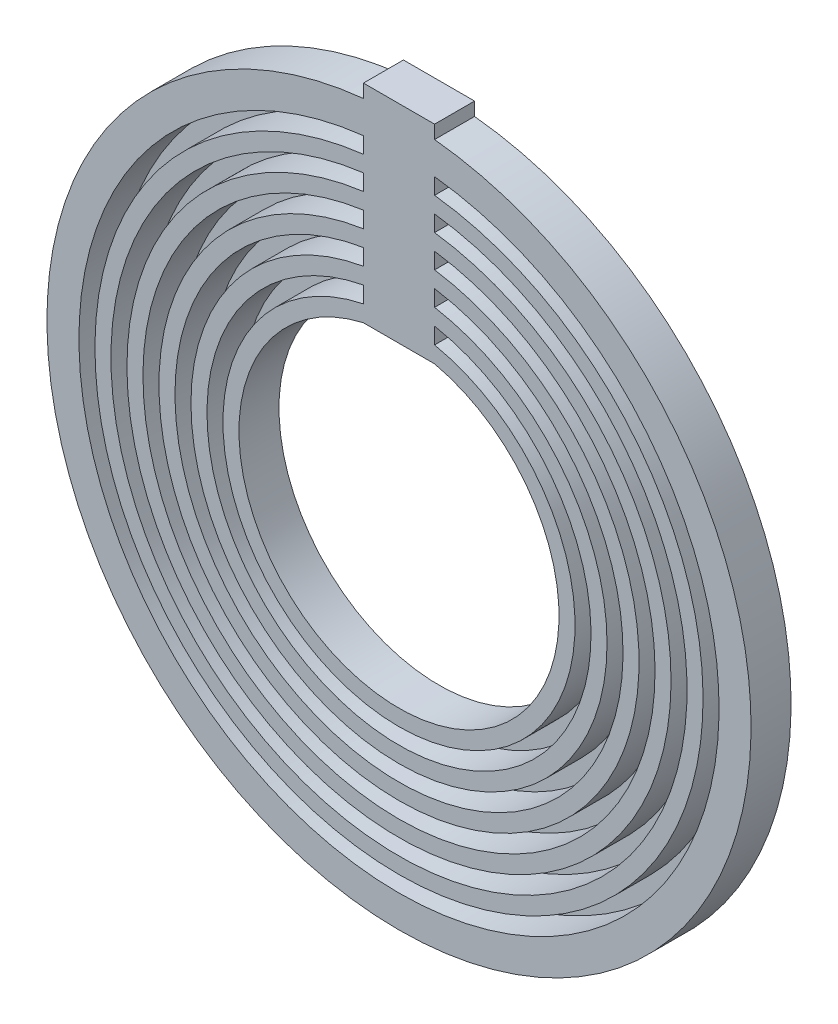
ISO-10303-21;
HEADER;
FILE_DESCRIPTION(('STEP AP214'),'2;1');
FILE_NAME('part.step','',(''),(''),'','','');
FILE_SCHEMA(('AUTOMOTIVE_DESIGN { 1 0 10303 214 1 1 1 1 }'));
ENDSEC;
DATA;
#1=APPLICATION_CONTEXT('core data for automotive mechanical design processes');
#2=APPLICATION_PROTOCOL_DEFINITION('international standard','automotive_design',2000,#1);
#3=PRODUCT_CONTEXT('',#1,'mechanical');
#4=PRODUCT('Part','Part','',(#3));
#5=PRODUCT_RELATED_PRODUCT_CATEGORY('part','',(#4));
#6=PRODUCT_DEFINITION_FORMATION('','',#4);
#7=PRODUCT_DEFINITION_CONTEXT('part definition',#1,'design');
#8=PRODUCT_DEFINITION('design','',#6,#7);
#9=PRODUCT_DEFINITION_SHAPE('','',#8);
#10=(LENGTH_UNIT() NAMED_UNIT(*) SI_UNIT(.MILLI.,.METRE.));
#11=(NAMED_UNIT(*) PLANE_ANGLE_UNIT() SI_UNIT($,.RADIAN.));
#12=(NAMED_UNIT(*) SI_UNIT($,.STERADIAN.) SOLID_ANGLE_UNIT());
#13=UNCERTAINTY_MEASURE_WITH_UNIT(LENGTH_MEASURE(1.E-05),#10,'distance_accuracy_value','');
#14=(GEOMETRIC_REPRESENTATION_CONTEXT(3) GLOBAL_UNCERTAINTY_ASSIGNED_CONTEXT((#13)) GLOBAL_UNIT_ASSIGNED_CONTEXT((#10,
#11,#12)) REPRESENTATION_CONTEXT('',''));
#15=CARTESIAN_POINT('',(0.,0.,0.));
#16=DIRECTION('',(0.,0.,1.));
#17=DIRECTION('',(1.,0.,0.));
#18=AXIS2_PLACEMENT_3D('',#15,#16,#17);
#19=CARTESIAN_POINT('',(0.,0.,2.5));
#20=DIRECTION('',(0.,0.,-1.));
#21=DIRECTION('',(-1.,0.,0.));
#22=AXIS2_PLACEMENT_3D('',#19,#20,#21);
#23=CYLINDRICAL_SURFACE('',#22,10.);
#24=CARTESIAN_POINT('',(0.,0.,2.5));
#25=DIRECTION('',(0.,0.,1.));
#26=DIRECTION('',(1.,0.,0.));
#27=AXIS2_PLACEMENT_3D('',#24,#25,#26);
#28=CIRCLE('',#27,10.);
#29=CARTESIAN_POINT('',(-2.22204860432891,9.75,2.5));
#30=VERTEX_POINT('',#29);
#31=CARTESIAN_POINT('',(2.22204860432891,9.75,2.5));
#32=VERTEX_POINT('',#31);
#33=EDGE_CURVE('E452',#30,#32,#28,.T.);
#34=ORIENTED_EDGE('',*,*,#33,.T.);
#35=DIRECTION('',(0.,0.,1.));
#36=VECTOR('',#35,1.);
#37=CARTESIAN_POINT('',(2.22204860432891,9.75,0.));
#38=LINE('',#37,#36);
#39=CARTESIAN_POINT('',(2.22204860432889,9.75,0.));
#40=VERTEX_POINT('',#39);
#41=EDGE_CURVE('E315',#40,#32,#38,.T.);
#42=ORIENTED_EDGE('',*,*,#41,.F.);
#43=CARTESIAN_POINT('',(0.,0.,0.));
#44=DIRECTION('',(0.,0.,1.));
#45=DIRECTION('',(1.,0.,0.));
#46=AXIS2_PLACEMENT_3D('',#43,#44,#45);
#47=CIRCLE('',#46,10.);
#48=CARTESIAN_POINT('',(-2.22204860432891,9.75,0.));
#49=VERTEX_POINT('',#48);
#50=EDGE_CURVE('E118',#49,#40,#47,.T.);
#51=ORIENTED_EDGE('',*,*,#50,.F.);
#52=DIRECTION('',(0.,0.,1.));
#53=VECTOR('',#52,1.);
#54=CARTESIAN_POINT('',(-2.22204860432891,9.75,0.));
#55=LINE('',#54,#53);
#56=EDGE_CURVE('E277',#49,#30,#55,.T.);
#57=ORIENTED_EDGE('',*,*,#56,.T.);
#58=EDGE_LOOP('',(#34,#42,#51,#57));
#59=FACE_BOUND('',#58,.T.);
#60=ADVANCED_FACE('F95',(#59),#23,.F.);
#61=CARTESIAN_POINT('',(0.,0.,2.5));
#62=DIRECTION('',(0.,0.,1.));
#63=DIRECTION('',(1.,0.,0.));
#64=AXIS2_PLACEMENT_3D('',#61,#62,#63);
#65=PLANE('',#64);
#66=CARTESIAN_POINT('',(0.,0.,2.5));
#67=DIRECTION('',(0.,0.,1.));
#68=DIRECTION('',(1.,0.,0.));
#69=AXIS2_PLACEMENT_3D('',#66,#67,#68);
#70=CIRCLE('',#69,19.);
#71=CARTESIAN_POINT('',(-2.22204860432891,18.8696184381137,2.5));
#72=VERTEX_POINT('',#71);
#73=CARTESIAN_POINT('',(2.22204860432891,18.8696184381137,2.5));
#74=VERTEX_POINT('',#73);
#75=EDGE_CURVE('E397',#72,#74,#70,.T.);
#76=ORIENTED_EDGE('',*,*,#75,.T.);
#77=DIRECTION('',(0.,1.,0.));
#78=VECTOR('',#77,1.);
#79=CARTESIAN_POINT('',(2.22204860432891,0.,2.5));
#80=LINE('',#79,#78);
#81=CARTESIAN_POINT('',(2.22204860432891,19.876179210301,2.5));
#82=VERTEX_POINT('',#81);
#83=EDGE_CURVE('E312',#74,#82,#80,.T.);
#84=ORIENTED_EDGE('',*,*,#83,.T.);
#85=CARTESIAN_POINT('',(0.,0.,2.5));
#86=DIRECTION('',(0.,0.,1.));
#87=DIRECTION('',(1.,0.,0.));
#88=AXIS2_PLACEMENT_3D('',#85,#86,#87);
#89=CIRCLE('',#88,20.);
#90=CARTESIAN_POINT('',(-2.22204860432891,19.876179210301,2.5));
#91=VERTEX_POINT('',#90);
#92=EDGE_CURVE('E402',#91,#82,#89,.T.);
#93=ORIENTED_EDGE('',*,*,#92,.F.);
#94=DIRECTION('',(0.,-1.,0.));
#95=VECTOR('',#94,1.);
#96=CARTESIAN_POINT('',(-2.22204860432891,0.,2.5));
#97=LINE('',#96,#95);
#98=EDGE_CURVE('E309',#91,#72,#97,.T.);
#99=ORIENTED_EDGE('',*,*,#98,.T.);
#100=EDGE_LOOP('',(#76,#84,#93,#99));
#101=FACE_BOUND('',#100,.T.);
#102=CARTESIAN_POINT('',(0.,0.,2.5));
#103=DIRECTION('',(0.,0.,1.));
#104=DIRECTION('',(1.,0.,0.));
#105=AXIS2_PLACEMENT_3D('',#102,#103,#104);
#106=CIRCLE('',#105,17.);
#107=CARTESIAN_POINT('',(-2.22204860432891,16.8541537906832,2.5));
#108=VERTEX_POINT('',#107);
#109=CARTESIAN_POINT('',(2.22204860432891,16.8541537906832,2.5));
#110=VERTEX_POINT('',#109);
#111=EDGE_CURVE('E405',#108,#110,#106,.T.);
#112=ORIENTED_EDGE('',*,*,#111,.T.);
#113=CARTESIAN_POINT('',(2.22204860432891,17.8623206778962,2.5));
#114=VERTEX_POINT('',#113);
#115=EDGE_CURVE('E478',#110,#114,#80,.T.);
#116=ORIENTED_EDGE('',*,*,#115,.T.);
#117=CARTESIAN_POINT('',(0.,0.,2.5));
#118=DIRECTION('',(0.,0.,1.));
#119=DIRECTION('',(1.,0.,0.));
#120=AXIS2_PLACEMENT_3D('',#117,#118,#119);
#121=CIRCLE('',#120,18.);
#122=CARTESIAN_POINT('',(-2.22204860432891,17.8623206778962,2.5));
#123=VERTEX_POINT('',#122);
#124=EDGE_CURVE('E413',#123,#114,#121,.T.);
#125=ORIENTED_EDGE('',*,*,#124,.F.);
#126=EDGE_CURVE('E509',#123,#108,#97,.T.);
#127=ORIENTED_EDGE('',*,*,#126,.T.);
#128=EDGE_LOOP('',(#112,#116,#125,#127));
#129=FACE_BOUND('',#128,.T.);
#130=CARTESIAN_POINT('',(0.,0.,2.5));
#131=DIRECTION('',(0.,0.,1.));
#132=DIRECTION('',(1.,0.,0.));
#133=AXIS2_PLACEMENT_3D('',#130,#131,#132);
#134=CIRCLE('',#133,15.);
#135=CARTESIAN_POINT('',(-2.22204860432891,14.8345036991468,2.5));
#136=VERTEX_POINT('',#135);
#137=CARTESIAN_POINT('',(2.22204860432891,14.8345036991468,2.5));
#138=VERTEX_POINT('',#137);
#139=EDGE_CURVE('E416',#136,#138,#134,.T.);
#140=ORIENTED_EDGE('',*,*,#139,.T.);
#141=CARTESIAN_POINT('',(2.22204860432891,15.8449518774908,2.5));
#142=VERTEX_POINT('',#141);
#143=EDGE_CURVE('E480',#138,#142,#80,.T.);
#144=ORIENTED_EDGE('',*,*,#143,.T.);
#145=CARTESIAN_POINT('',(0.,0.,2.5));
#146=DIRECTION('',(0.,0.,1.));
#147=DIRECTION('',(1.,0.,0.));
#148=AXIS2_PLACEMENT_3D('',#145,#146,#147);
#149=CIRCLE('',#148,16.);
#150=CARTESIAN_POINT('',(-2.22204860432891,15.8449518774908,2.5));
#151=VERTEX_POINT('',#150);
#152=EDGE_CURVE('E424',#151,#142,#149,.T.);
#153=ORIENTED_EDGE('',*,*,#152,.F.);
#154=EDGE_CURVE('E507',#151,#136,#97,.T.);
#155=ORIENTED_EDGE('',*,*,#154,.T.);
#156=EDGE_LOOP('',(#140,#144,#153,#155));
#157=FACE_BOUND('',#156,.T.);
#158=CARTESIAN_POINT('',(0.,0.,2.5));
#159=DIRECTION('',(0.,0.,1.));
#160=DIRECTION('',(1.,0.,0.));
#161=AXIS2_PLACEMENT_3D('',#158,#159,#160);
#162=CIRCLE('',#161,13.);
#163=CARTESIAN_POINT('',(-2.22204860432891,12.8086884574495,2.5));
#164=VERTEX_POINT('',#163);
#165=CARTESIAN_POINT('',(2.22204860432891,12.8086884574495,2.5));
#166=VERTEX_POINT('',#165);
#167=EDGE_CURVE('E427',#164,#166,#162,.T.);
#168=ORIENTED_EDGE('',*,*,#167,.T.);
#169=CARTESIAN_POINT('',(2.22204860432891,13.8225359467791,2.5));
#170=VERTEX_POINT('',#169);
#171=EDGE_CURVE('E298',#166,#170,#80,.T.);
#172=ORIENTED_EDGE('',*,*,#171,.T.);
#173=CARTESIAN_POINT('',(0.,0.,2.5));
#174=DIRECTION('',(0.,0.,1.));
#175=DIRECTION('',(1.,0.,0.));
#176=AXIS2_PLACEMENT_3D('',#173,#174,#175);
#177=CIRCLE('',#176,14.);
#178=CARTESIAN_POINT('',(-2.22204860432891,13.8225359467791,2.5));
#179=VERTEX_POINT('',#178);
#180=EDGE_CURVE('E435',#179,#170,#177,.T.);
#181=ORIENTED_EDGE('',*,*,#180,.F.);
#182=EDGE_CURVE('E506',#179,#164,#97,.T.);
#183=ORIENTED_EDGE('',*,*,#182,.T.);
#184=EDGE_LOOP('',(#168,#172,#181,#183));
#185=FACE_BOUND('',#184,.T.);
#186=CARTESIAN_POINT('',(0.,0.,2.5));
#187=DIRECTION('',(0.,0.,1.));
#188=DIRECTION('',(1.,0.,0.));
#189=AXIS2_PLACEMENT_3D('',#186,#187,#188);
#190=CIRCLE('',#189,11.);
#191=CARTESIAN_POINT('',(-2.22204860432891,10.7732307132076,2.5));
#192=VERTEX_POINT('',#191);
#193=CARTESIAN_POINT('',(2.22204860432891,10.7732307132076,2.5));
#194=VERTEX_POINT('',#193);
#195=EDGE_CURVE('E438',#192,#194,#190,.T.);
#196=ORIENTED_EDGE('',*,*,#195,.T.);
#197=CARTESIAN_POINT('',(2.22204860432891,11.7924764150708,2.5));
#198=VERTEX_POINT('',#197);
#199=EDGE_CURVE('E295',#194,#198,#80,.T.);
#200=ORIENTED_EDGE('',*,*,#199,.T.);
#201=CARTESIAN_POINT('',(0.,0.,2.5));
#202=DIRECTION('',(0.,0.,1.));
#203=DIRECTION('',(1.,0.,0.));
#204=AXIS2_PLACEMENT_3D('',#201,#202,#203);
#205=CIRCLE('',#204,12.);
#206=CARTESIAN_POINT('',(-2.22204860432891,11.7924764150708,2.5));
#207=VERTEX_POINT('',#206);
#208=EDGE_CURVE('E446',#207,#198,#205,.T.);
#209=ORIENTED_EDGE('',*,*,#208,.F.);
#210=EDGE_CURVE('E306',#207,#192,#97,.T.);
#211=ORIENTED_EDGE('',*,*,#210,.T.);
#212=EDGE_LOOP('',(#196,#200,#209,#211));
#213=FACE_BOUND('',#212,.T.);
#214=CARTESIAN_POINT('',(0.,0.,2.5));
#215=DIRECTION('',(0.,0.,1.));
#216=DIRECTION('',(1.,0.,0.));
#217=AXIS2_PLACEMENT_3D('',#214,#215,#216);
#218=CIRCLE('',#217,22.);
#219=CARTESIAN_POINT('',(-2.22204860432891,21.8874964306108,2.5));
#220=VERTEX_POINT('',#219);
#221=CARTESIAN_POINT('',(2.22204860432891,21.8874964306108,2.5));
#222=VERTEX_POINT('',#221);
#223=EDGE_CURVE('E455',#220,#222,#218,.T.);
#224=ORIENTED_EDGE('',*,*,#223,.T.);
#225=CARTESIAN_POINT('',(2.22204860432891,22.7219771811562,2.5));
#226=VERTEX_POINT('',#225);
#227=EDGE_CURVE('E300',#222,#226,#80,.T.);
#228=ORIENTED_EDGE('',*,*,#227,.T.);
#229=DIRECTION('',(-1.,0.,0.));
#230=VECTOR('',#229,1.);
#231=CARTESIAN_POINT('',(0.,22.7219771811562,2.5));
#232=LINE('',#231,#230);
#233=CARTESIAN_POINT('',(-2.22204860432891,22.7219771811562,2.5));
#234=VERTEX_POINT('',#233);
#235=EDGE_CURVE('E304',#226,#234,#232,.T.);
#236=ORIENTED_EDGE('',*,*,#235,.T.);
#237=EDGE_CURVE('E110',#234,#220,#97,.T.);
#238=ORIENTED_EDGE('',*,*,#237,.T.);
#239=EDGE_LOOP('',(#224,#228,#236,#238));
#240=FACE_BOUND('',#239,.T.);
#241=DIRECTION('',(-1.,0.,0.));
#242=VECTOR('',#241,1.);
#243=CARTESIAN_POINT('',(0.,9.75,2.5));
#244=LINE('',#243,#242);
#245=EDGE_CURVE('E308',#32,#30,#244,.T.);
#246=ORIENTED_EDGE('',*,*,#245,.F.);
#247=ORIENTED_EDGE('',*,*,#33,.F.);
#248=EDGE_LOOP('',(#246,#247));
#249=FACE_BOUND('',#248,.T.);
#250=ADVANCED_FACE('F476',(#101,#129,#157,#185,#213,#240,#249),#65,.T.);
#251=CARTESIAN_POINT('',(0.,0.,0.));
#252=DIRECTION('',(0.,0.,1.));
#253=DIRECTION('',(1.,0.,0.));
#254=AXIS2_PLACEMENT_3D('',#251,#252,#253);
#255=PLANE('',#254);
#256=DIRECTION('',(0.,1.,0.));
#257=VECTOR('',#256,1.);
#258=CARTESIAN_POINT('',(2.22204860432891,0.,0.));
#259=LINE('',#258,#257);
#260=CARTESIAN_POINT('',(2.22204860432891,21.8874964306108,0.));
#261=VERTEX_POINT('',#260);
#262=CARTESIAN_POINT('',(2.22204860432891,22.7219771811562,0.));
#263=VERTEX_POINT('',#262);
#264=EDGE_CURVE('E278',#261,#263,#259,.T.);
#265=ORIENTED_EDGE('',*,*,#264,.F.);
#266=CARTESIAN_POINT('',(0.,0.,0.));
#267=DIRECTION('',(0.,0.,1.));
#268=DIRECTION('',(1.,0.,0.));
#269=AXIS2_PLACEMENT_3D('',#266,#267,#268);
#270=CIRCLE('',#269,22.);
#271=CARTESIAN_POINT('',(-2.22204860432891,21.8874964306108,0.));
#272=VERTEX_POINT('',#271);
#273=EDGE_CURVE('E288',#272,#261,#270,.T.);
#274=ORIENTED_EDGE('',*,*,#273,.F.);
#275=DIRECTION('',(0.,-1.,0.));
#276=VECTOR('',#275,1.);
#277=CARTESIAN_POINT('',(-2.22204860432891,0.,0.));
#278=LINE('',#277,#276);
#279=CARTESIAN_POINT('',(-2.22204860432891,22.7219771811562,0.));
#280=VERTEX_POINT('',#279);
#281=EDGE_CURVE('E272',#280,#272,#278,.T.);
#282=ORIENTED_EDGE('',*,*,#281,.F.);
#283=DIRECTION('',(-1.,0.,0.));
#284=VECTOR('',#283,1.);
#285=CARTESIAN_POINT('',(0.,22.7219771811562,0.));
#286=LINE('',#285,#284);
#287=EDGE_CURVE('E286',#263,#280,#286,.T.);
#288=ORIENTED_EDGE('',*,*,#287,.F.);
#289=EDGE_LOOP('',(#265,#274,#282,#288));
#290=FACE_BOUND('',#289,.T.);
#291=ORIENTED_EDGE('',*,*,#50,.T.);
#292=DIRECTION('',(-1.,0.,0.));
#293=VECTOR('',#292,1.);
#294=CARTESIAN_POINT('',(0.,9.75,0.));
#295=LINE('',#294,#293);
#296=EDGE_CURVE('E289',#40,#49,#295,.T.);
#297=ORIENTED_EDGE('',*,*,#296,.T.);
#298=EDGE_LOOP('',(#291,#297));
#299=FACE_BOUND('',#298,.T.);
#300=ADVANCED_FACE('F284',(#290,#299),#255,.F.);
#301=CARTESIAN_POINT('',(0.,0.,2.5));
#302=DIRECTION('',(0.,0.,-1.));
#303=DIRECTION('',(-1.,0.,0.));
#304=AXIS2_PLACEMENT_3D('',#301,#302,#303);
#305=CYLINDRICAL_SURFACE('',#304,22.);
#306=ORIENTED_EDGE('',*,*,#273,.T.);
#307=DIRECTION('',(0.,0.,-1.));
#308=VECTOR('',#307,1.);
#309=CARTESIAN_POINT('',(2.22204860432891,21.8874964306108,2.5));
#310=LINE('',#309,#308);
#311=EDGE_CURVE('E394',#261,#222,#310,.F.);
#312=ORIENTED_EDGE('',*,*,#311,.T.);
#313=ORIENTED_EDGE('',*,*,#223,.F.);
#314=DIRECTION('',(0.,0.,-1.));
#315=VECTOR('',#314,1.);
#316=CARTESIAN_POINT('',(-2.22204860432891,21.8874964306108,2.5));
#317=LINE('',#316,#315);
#318=EDGE_CURVE('E355',#220,#272,#317,.T.);
#319=ORIENTED_EDGE('',*,*,#318,.T.);
#320=EDGE_LOOP('',(#306,#312,#313,#319));
#321=FACE_BOUND('',#320,.T.);
#322=ADVANCED_FACE('F97',(#321),#305,.T.);
#323=CARTESIAN_POINT('',(0.,0.,0.25));
#324=DIRECTION('',(0.,0.,1.));
#325=DIRECTION('',(1.,0.,0.));
#326=AXIS2_PLACEMENT_3D('',#323,#324,#325);
#327=CYLINDRICAL_SURFACE('',#326,11.);
#328=DIRECTION('',(0.,0.,1.));
#329=VECTOR('',#328,1.);
#330=CARTESIAN_POINT('',(2.22204860432891,10.7732307132076,0.25));
#331=LINE('',#330,#329);
#332=CARTESIAN_POINT('',(2.22204860432891,10.7732307132076,0.25));
#333=VERTEX_POINT('',#332);
#334=EDGE_CURVE('E391',#194,#333,#331,.F.);
#335=ORIENTED_EDGE('',*,*,#334,.F.);
#336=ORIENTED_EDGE('',*,*,#195,.F.);
#337=DIRECTION('',(0.,0.,1.));
#338=VECTOR('',#337,1.);
#339=CARTESIAN_POINT('',(-2.22204860432891,10.7732307132076,0.25));
#340=LINE('',#339,#338);
#341=CARTESIAN_POINT('',(-2.22204860432891,10.7732307132076,0.25));
#342=VERTEX_POINT('',#341);
#343=EDGE_CURVE('E352',#342,#192,#340,.T.);
#344=ORIENTED_EDGE('',*,*,#343,.F.);
#345=CARTESIAN_POINT('',(0.,0.,0.25));
#346=DIRECTION('',(0.,0.,1.));
#347=DIRECTION('',(1.,0.,0.));
#348=AXIS2_PLACEMENT_3D('',#345,#346,#347);
#349=CIRCLE('',#348,11.);
#350=EDGE_CURVE('E442',#342,#333,#349,.T.);
#351=ORIENTED_EDGE('',*,*,#350,.T.);
#352=EDGE_LOOP('',(#335,#336,#344,#351));
#353=FACE_BOUND('',#352,.T.);
#354=ADVANCED_FACE('F519',(#353),#327,.T.);
#355=CARTESIAN_POINT('',(0.,0.,0.25));
#356=DIRECTION('',(0.,0.,1.));
#357=DIRECTION('',(1.,0.,0.));
#358=AXIS2_PLACEMENT_3D('',#355,#356,#357);
#359=CYLINDRICAL_SURFACE('',#358,12.);
#360=ORIENTED_EDGE('',*,*,#208,.T.);
#361=DIRECTION('',(0.,0.,1.));
#362=VECTOR('',#361,1.);
#363=CARTESIAN_POINT('',(2.22204860432891,11.7924764150708,0.25));
#364=LINE('',#363,#362);
#365=CARTESIAN_POINT('',(2.22204860432891,11.7924764150708,0.25));
#366=VERTEX_POINT('',#365);
#367=EDGE_CURVE('E389',#198,#366,#364,.F.);
#368=ORIENTED_EDGE('',*,*,#367,.T.);
#369=CARTESIAN_POINT('',(0.,0.,0.25));
#370=DIRECTION('',(0.,0.,1.));
#371=DIRECTION('',(1.,0.,0.));
#372=AXIS2_PLACEMENT_3D('',#369,#370,#371);
#373=CIRCLE('',#372,12.);
#374=CARTESIAN_POINT('',(-2.22204860432891,11.7924764150708,0.25));
#375=VERTEX_POINT('',#374);
#376=EDGE_CURVE('E445',#375,#366,#373,.T.);
#377=ORIENTED_EDGE('',*,*,#376,.F.);
#378=DIRECTION('',(0.,0.,1.));
#379=VECTOR('',#378,1.);
#380=CARTESIAN_POINT('',(-2.22204860432891,11.7924764150708,0.25));
#381=LINE('',#380,#379);
#382=EDGE_CURVE('E350',#375,#207,#381,.T.);
#383=ORIENTED_EDGE('',*,*,#382,.T.);
#384=EDGE_LOOP('',(#360,#368,#377,#383));
#385=FACE_BOUND('',#384,.T.);
#386=ADVANCED_FACE('F525',(#385),#359,.F.);
#387=CARTESIAN_POINT('',(0.,0.,0.25));
#388=DIRECTION('',(0.,0.,1.));
#389=DIRECTION('',(1.,0.,0.));
#390=AXIS2_PLACEMENT_3D('',#387,#388,#389);
#391=PLANE('',#390);
#392=DIRECTION('',(0.,1.,0.));
#393=VECTOR('',#392,1.);
#394=CARTESIAN_POINT('',(2.22204860432891,0.,0.25));
#395=LINE('',#394,#393);
#396=EDGE_CURVE('E386',#333,#366,#395,.T.);
#397=ORIENTED_EDGE('',*,*,#396,.F.);
#398=ORIENTED_EDGE('',*,*,#350,.F.);
#399=DIRECTION('',(0.,-1.,0.));
#400=VECTOR('',#399,1.);
#401=CARTESIAN_POINT('',(-2.22204860432891,0.,0.25));
#402=LINE('',#401,#400);
#403=EDGE_CURVE('E347',#375,#342,#402,.T.);
#404=ORIENTED_EDGE('',*,*,#403,.F.);
#405=ORIENTED_EDGE('',*,*,#376,.T.);
#406=EDGE_LOOP('',(#397,#398,#404,#405));
#407=FACE_BOUND('',#406,.T.);
#408=ADVANCED_FACE('F527',(#407),#391,.T.);
#409=CARTESIAN_POINT('',(0.,0.,0.25));
#410=DIRECTION('',(0.,0.,1.));
#411=DIRECTION('',(1.,0.,0.));
#412=AXIS2_PLACEMENT_3D('',#409,#410,#411);
#413=CYLINDRICAL_SURFACE('',#412,13.);
#414=DIRECTION('',(0.,0.,1.));
#415=VECTOR('',#414,1.);
#416=CARTESIAN_POINT('',(2.22204860432891,12.8086884574495,0.25));
#417=LINE('',#416,#415);
#418=CARTESIAN_POINT('',(2.22204860432891,12.8086884574495,0.25));
#419=VERTEX_POINT('',#418);
#420=EDGE_CURVE('E383',#166,#419,#417,.F.);
#421=ORIENTED_EDGE('',*,*,#420,.F.);
#422=ORIENTED_EDGE('',*,*,#167,.F.);
#423=DIRECTION('',(0.,0.,1.));
#424=VECTOR('',#423,1.);
#425=CARTESIAN_POINT('',(-2.22204860432891,12.8086884574495,0.25));
#426=LINE('',#425,#424);
#427=CARTESIAN_POINT('',(-2.22204860432891,12.8086884574495,0.25));
#428=VERTEX_POINT('',#427);
#429=EDGE_CURVE('E344',#428,#164,#426,.T.);
#430=ORIENTED_EDGE('',*,*,#429,.F.);
#431=CARTESIAN_POINT('',(0.,0.,0.25));
#432=DIRECTION('',(0.,0.,1.));
#433=DIRECTION('',(1.,0.,0.));
#434=AXIS2_PLACEMENT_3D('',#431,#432,#433);
#435=CIRCLE('',#434,13.);
#436=EDGE_CURVE('E431',#428,#419,#435,.T.);
#437=ORIENTED_EDGE('',*,*,#436,.T.);
#438=EDGE_LOOP('',(#421,#422,#430,#437));
#439=FACE_BOUND('',#438,.T.);
#440=ADVANCED_FACE('F529',(#439),#413,.T.);
#441=CARTESIAN_POINT('',(0.,0.,0.25));
#442=DIRECTION('',(0.,0.,1.));
#443=DIRECTION('',(1.,0.,0.));
#444=AXIS2_PLACEMENT_3D('',#441,#442,#443);
#445=CYLINDRICAL_SURFACE('',#444,14.);
#446=ORIENTED_EDGE('',*,*,#180,.T.);
#447=DIRECTION('',(0.,0.,1.));
#448=VECTOR('',#447,1.);
#449=CARTESIAN_POINT('',(2.22204860432891,13.8225359467791,0.25));
#450=LINE('',#449,#448);
#451=CARTESIAN_POINT('',(2.22204860432891,13.8225359467791,0.25));
#452=VERTEX_POINT('',#451);
#453=EDGE_CURVE('E381',#170,#452,#450,.F.);
#454=ORIENTED_EDGE('',*,*,#453,.T.);
#455=CARTESIAN_POINT('',(0.,0.,0.25));
#456=DIRECTION('',(0.,0.,1.));
#457=DIRECTION('',(1.,0.,0.));
#458=AXIS2_PLACEMENT_3D('',#455,#456,#457);
#459=CIRCLE('',#458,14.);
#460=CARTESIAN_POINT('',(-2.22204860432891,13.8225359467791,0.25));
#461=VERTEX_POINT('',#460);
#462=EDGE_CURVE('E434',#461,#452,#459,.T.);
#463=ORIENTED_EDGE('',*,*,#462,.F.);
#464=DIRECTION('',(0.,0.,1.));
#465=VECTOR('',#464,1.);
#466=CARTESIAN_POINT('',(-2.22204860432891,13.8225359467791,0.25));
#467=LINE('',#466,#465);
#468=EDGE_CURVE('E342',#461,#179,#467,.T.);
#469=ORIENTED_EDGE('',*,*,#468,.T.);
#470=EDGE_LOOP('',(#446,#454,#463,#469));
#471=FACE_BOUND('',#470,.T.);
#472=ADVANCED_FACE('F499',(#471),#445,.F.);
#473=CARTESIAN_POINT('',(0.,0.,0.25));
#474=DIRECTION('',(0.,0.,1.));
#475=DIRECTION('',(1.,0.,0.));
#476=AXIS2_PLACEMENT_3D('',#473,#474,#475);
#477=PLANE('',#476);
#478=DIRECTION('',(0.,1.,0.));
#479=VECTOR('',#478,1.);
#480=CARTESIAN_POINT('',(2.22204860432891,0.,0.25));
#481=LINE('',#480,#479);
#482=EDGE_CURVE('E378',#419,#452,#481,.T.);
#483=ORIENTED_EDGE('',*,*,#482,.F.);
#484=ORIENTED_EDGE('',*,*,#436,.F.);
#485=DIRECTION('',(0.,-1.,0.));
#486=VECTOR('',#485,1.);
#487=CARTESIAN_POINT('',(-2.22204860432891,0.,0.25));
#488=LINE('',#487,#486);
#489=EDGE_CURVE('E339',#461,#428,#488,.T.);
#490=ORIENTED_EDGE('',*,*,#489,.F.);
#491=ORIENTED_EDGE('',*,*,#462,.T.);
#492=EDGE_LOOP('',(#483,#484,#490,#491));
#493=FACE_BOUND('',#492,.T.);
#494=ADVANCED_FACE('F502',(#493),#477,.T.);
#495=CARTESIAN_POINT('',(0.,0.,0.25));
#496=DIRECTION('',(0.,0.,1.));
#497=DIRECTION('',(1.,0.,0.));
#498=AXIS2_PLACEMENT_3D('',#495,#496,#497);
#499=CYLINDRICAL_SURFACE('',#498,15.);
#500=DIRECTION('',(0.,0.,1.));
#501=VECTOR('',#500,1.);
#502=CARTESIAN_POINT('',(2.22204860432891,14.8345036991468,0.25));
#503=LINE('',#502,#501);
#504=CARTESIAN_POINT('',(2.22204860432891,14.8345036991468,0.25));
#505=VERTEX_POINT('',#504);
#506=EDGE_CURVE('E375',#138,#505,#503,.F.);
#507=ORIENTED_EDGE('',*,*,#506,.F.);
#508=ORIENTED_EDGE('',*,*,#139,.F.);
#509=DIRECTION('',(0.,0.,1.));
#510=VECTOR('',#509,1.);
#511=CARTESIAN_POINT('',(-2.22204860432891,14.8345036991468,0.25));
#512=LINE('',#511,#510);
#513=CARTESIAN_POINT('',(-2.22204860432891,14.8345036991468,0.25));
#514=VERTEX_POINT('',#513);
#515=EDGE_CURVE('E336',#514,#136,#512,.T.);
#516=ORIENTED_EDGE('',*,*,#515,.F.);
#517=CARTESIAN_POINT('',(0.,0.,0.25));
#518=DIRECTION('',(0.,0.,1.));
#519=DIRECTION('',(1.,0.,0.));
#520=AXIS2_PLACEMENT_3D('',#517,#518,#519);
#521=CIRCLE('',#520,15.);
#522=EDGE_CURVE('E420',#514,#505,#521,.T.);
#523=ORIENTED_EDGE('',*,*,#522,.T.);
#524=EDGE_LOOP('',(#507,#508,#516,#523));
#525=FACE_BOUND('',#524,.T.);
#526=ADVANCED_FACE('F655',(#525),#499,.T.);
#527=CARTESIAN_POINT('',(0.,0.,0.25));
#528=DIRECTION('',(0.,0.,1.));
#529=DIRECTION('',(1.,0.,0.));
#530=AXIS2_PLACEMENT_3D('',#527,#528,#529);
#531=CYLINDRICAL_SURFACE('',#530,16.);
#532=ORIENTED_EDGE('',*,*,#152,.T.);
#533=DIRECTION('',(0.,0.,1.));
#534=VECTOR('',#533,1.);
#535=CARTESIAN_POINT('',(2.22204860432891,15.8449518774908,0.25));
#536=LINE('',#535,#534);
#537=CARTESIAN_POINT('',(2.22204860432891,15.8449518774908,0.25));
#538=VERTEX_POINT('',#537);
#539=EDGE_CURVE('E373',#142,#538,#536,.F.);
#540=ORIENTED_EDGE('',*,*,#539,.T.);
#541=CARTESIAN_POINT('',(0.,0.,0.25));
#542=DIRECTION('',(0.,0.,1.));
#543=DIRECTION('',(1.,0.,0.));
#544=AXIS2_PLACEMENT_3D('',#541,#542,#543);
#545=CIRCLE('',#544,16.);
#546=CARTESIAN_POINT('',(-2.22204860432891,15.8449518774908,0.25));
#547=VERTEX_POINT('',#546);
#548=EDGE_CURVE('E423',#547,#538,#545,.T.);
#549=ORIENTED_EDGE('',*,*,#548,.F.);
#550=DIRECTION('',(0.,0.,1.));
#551=VECTOR('',#550,1.);
#552=CARTESIAN_POINT('',(-2.22204860432891,15.8449518774908,0.25));
#553=LINE('',#552,#551);
#554=EDGE_CURVE('E334',#547,#151,#553,.T.);
#555=ORIENTED_EDGE('',*,*,#554,.T.);
#556=EDGE_LOOP('',(#532,#540,#549,#555));
#557=FACE_BOUND('',#556,.T.);
#558=ADVANCED_FACE('F651',(#557),#531,.F.);
#559=CARTESIAN_POINT('',(0.,0.,0.25));
#560=DIRECTION('',(0.,0.,1.));
#561=DIRECTION('',(1.,0.,0.));
#562=AXIS2_PLACEMENT_3D('',#559,#560,#561);
#563=PLANE('',#562);
#564=DIRECTION('',(0.,1.,0.));
#565=VECTOR('',#564,1.);
#566=CARTESIAN_POINT('',(2.22204860432891,0.,0.25));
#567=LINE('',#566,#565);
#568=EDGE_CURVE('E370',#505,#538,#567,.T.);
#569=ORIENTED_EDGE('',*,*,#568,.F.);
#570=ORIENTED_EDGE('',*,*,#522,.F.);
#571=DIRECTION('',(0.,-1.,0.));
#572=VECTOR('',#571,1.);
#573=CARTESIAN_POINT('',(-2.22204860432891,0.,0.25));
#574=LINE('',#573,#572);
#575=EDGE_CURVE('E331',#547,#514,#574,.T.);
#576=ORIENTED_EDGE('',*,*,#575,.F.);
#577=ORIENTED_EDGE('',*,*,#548,.T.);
#578=EDGE_LOOP('',(#569,#570,#576,#577));
#579=FACE_BOUND('',#578,.T.);
#580=ADVANCED_FACE('F647',(#579),#563,.T.);
#581=CARTESIAN_POINT('',(0.,0.,0.25));
#582=DIRECTION('',(0.,0.,1.));
#583=DIRECTION('',(1.,0.,0.));
#584=AXIS2_PLACEMENT_3D('',#581,#582,#583);
#585=CYLINDRICAL_SURFACE('',#584,17.);
#586=DIRECTION('',(0.,0.,1.));
#587=VECTOR('',#586,1.);
#588=CARTESIAN_POINT('',(2.22204860432891,16.8541537906832,0.25));
#589=LINE('',#588,#587);
#590=CARTESIAN_POINT('',(2.22204860432891,16.8541537906832,0.25));
#591=VERTEX_POINT('',#590);
#592=EDGE_CURVE('E367',#110,#591,#589,.F.);
#593=ORIENTED_EDGE('',*,*,#592,.F.);
#594=ORIENTED_EDGE('',*,*,#111,.F.);
#595=DIRECTION('',(0.,0.,1.));
#596=VECTOR('',#595,1.);
#597=CARTESIAN_POINT('',(-2.22204860432891,16.8541537906832,0.25));
#598=LINE('',#597,#596);
#599=CARTESIAN_POINT('',(-2.22204860432891,16.8541537906832,0.25));
#600=VERTEX_POINT('',#599);
#601=EDGE_CURVE('E328',#600,#108,#598,.T.);
#602=ORIENTED_EDGE('',*,*,#601,.F.);
#603=CARTESIAN_POINT('',(0.,0.,0.25));
#604=DIRECTION('',(0.,0.,1.));
#605=DIRECTION('',(1.,0.,0.));
#606=AXIS2_PLACEMENT_3D('',#603,#604,#605);
#607=CIRCLE('',#606,17.);
#608=EDGE_CURVE('E409',#600,#591,#607,.T.);
#609=ORIENTED_EDGE('',*,*,#608,.T.);
#610=EDGE_LOOP('',(#593,#594,#602,#609));
#611=FACE_BOUND('',#610,.T.);
#612=ADVANCED_FACE('F643',(#611),#585,.T.);
#613=CARTESIAN_POINT('',(0.,0.,0.25));
#614=DIRECTION('',(0.,0.,1.));
#615=DIRECTION('',(1.,0.,0.));
#616=AXIS2_PLACEMENT_3D('',#613,#614,#615);
#617=CYLINDRICAL_SURFACE('',#616,18.);
#618=ORIENTED_EDGE('',*,*,#124,.T.);
#619=DIRECTION('',(0.,0.,1.));
#620=VECTOR('',#619,1.);
#621=CARTESIAN_POINT('',(2.22204860432891,17.8623206778962,0.25));
#622=LINE('',#621,#620);
#623=CARTESIAN_POINT('',(2.22204860432891,17.8623206778962,0.25));
#624=VERTEX_POINT('',#623);
#625=EDGE_CURVE('E365',#114,#624,#622,.F.);
#626=ORIENTED_EDGE('',*,*,#625,.T.);
#627=CARTESIAN_POINT('',(0.,0.,0.25));
#628=DIRECTION('',(0.,0.,1.));
#629=DIRECTION('',(1.,0.,0.));
#630=AXIS2_PLACEMENT_3D('',#627,#628,#629);
#631=CIRCLE('',#630,18.);
#632=CARTESIAN_POINT('',(-2.22204860432891,17.8623206778962,0.25));
#633=VERTEX_POINT('',#632);
#634=EDGE_CURVE('E412',#633,#624,#631,.T.);
#635=ORIENTED_EDGE('',*,*,#634,.F.);
#636=DIRECTION('',(0.,0.,1.));
#637=VECTOR('',#636,1.);
#638=CARTESIAN_POINT('',(-2.22204860432891,17.8623206778962,0.25));
#639=LINE('',#638,#637);
#640=EDGE_CURVE('E326',#633,#123,#639,.T.);
#641=ORIENTED_EDGE('',*,*,#640,.T.);
#642=EDGE_LOOP('',(#618,#626,#635,#641));
#643=FACE_BOUND('',#642,.T.);
#644=ADVANCED_FACE('F639',(#643),#617,.F.);
#645=CARTESIAN_POINT('',(0.,0.,0.25));
#646=DIRECTION('',(0.,0.,1.));
#647=DIRECTION('',(1.,0.,0.));
#648=AXIS2_PLACEMENT_3D('',#645,#646,#647);
#649=PLANE('',#648);
#650=DIRECTION('',(0.,1.,0.));
#651=VECTOR('',#650,1.);
#652=CARTESIAN_POINT('',(2.22204860432891,0.,0.25));
#653=LINE('',#652,#651);
#654=EDGE_CURVE('E362',#591,#624,#653,.T.);
#655=ORIENTED_EDGE('',*,*,#654,.F.);
#656=ORIENTED_EDGE('',*,*,#608,.F.);
#657=DIRECTION('',(0.,-1.,0.));
#658=VECTOR('',#657,1.);
#659=CARTESIAN_POINT('',(-2.22204860432891,0.,0.25));
#660=LINE('',#659,#658);
#661=EDGE_CURVE('E323',#633,#600,#660,.T.);
#662=ORIENTED_EDGE('',*,*,#661,.F.);
#663=ORIENTED_EDGE('',*,*,#634,.T.);
#664=EDGE_LOOP('',(#655,#656,#662,#663));
#665=FACE_BOUND('',#664,.T.);
#666=ADVANCED_FACE('F635',(#665),#649,.T.);
#667=CARTESIAN_POINT('',(0.,0.,0.25));
#668=DIRECTION('',(0.,0.,1.));
#669=DIRECTION('',(1.,0.,0.));
#670=AXIS2_PLACEMENT_3D('',#667,#668,#669);
#671=CYLINDRICAL_SURFACE('',#670,19.);
#672=DIRECTION('',(0.,0.,1.));
#673=VECTOR('',#672,1.);
#674=CARTESIAN_POINT('',(2.22204860432891,18.8696184381137,0.25));
#675=LINE('',#674,#673);
#676=CARTESIAN_POINT('',(2.22204860432891,18.8696184381137,0.25));
#677=VERTEX_POINT('',#676);
#678=EDGE_CURVE('E359',#74,#677,#675,.F.);
#679=ORIENTED_EDGE('',*,*,#678,.F.);
#680=ORIENTED_EDGE('',*,*,#75,.F.);
#681=DIRECTION('',(0.,0.,1.));
#682=VECTOR('',#681,1.);
#683=CARTESIAN_POINT('',(-2.22204860432891,18.8696184381137,0.25));
#684=LINE('',#683,#682);
#685=CARTESIAN_POINT('',(-2.22204860432891,18.8696184381137,0.25));
#686=VERTEX_POINT('',#685);
#687=EDGE_CURVE('E320',#686,#72,#684,.T.);
#688=ORIENTED_EDGE('',*,*,#687,.F.);
#689=CARTESIAN_POINT('',(0.,0.,0.25));
#690=DIRECTION('',(0.,0.,1.));
#691=DIRECTION('',(1.,0.,0.));
#692=AXIS2_PLACEMENT_3D('',#689,#690,#691);
#693=CIRCLE('',#692,19.);
#694=EDGE_CURVE('E398',#686,#677,#693,.T.);
#695=ORIENTED_EDGE('',*,*,#694,.T.);
#696=EDGE_LOOP('',(#679,#680,#688,#695));
#697=FACE_BOUND('',#696,.T.);
#698=ADVANCED_FACE('F632',(#697),#671,.T.);
#699=CARTESIAN_POINT('',(0.,0.,0.25));
#700=DIRECTION('',(0.,0.,1.));
#701=DIRECTION('',(1.,0.,0.));
#702=AXIS2_PLACEMENT_3D('',#699,#700,#701);
#703=CYLINDRICAL_SURFACE('',#702,20.);
#704=ORIENTED_EDGE('',*,*,#92,.T.);
#705=DIRECTION('',(0.,0.,1.));
#706=VECTOR('',#705,1.);
#707=CARTESIAN_POINT('',(2.22204860432891,19.876179210301,0.25));
#708=LINE('',#707,#706);
#709=CARTESIAN_POINT('',(2.22204860432891,19.876179210301,0.25));
#710=VERTEX_POINT('',#709);
#711=EDGE_CURVE('E357',#82,#710,#708,.F.);
#712=ORIENTED_EDGE('',*,*,#711,.T.);
#713=CARTESIAN_POINT('',(0.,0.,0.25));
#714=DIRECTION('',(0.,0.,1.));
#715=DIRECTION('',(1.,0.,0.));
#716=AXIS2_PLACEMENT_3D('',#713,#714,#715);
#717=CIRCLE('',#716,20.);
#718=CARTESIAN_POINT('',(-2.22204860432891,19.876179210301,0.25));
#719=VERTEX_POINT('',#718);
#720=EDGE_CURVE('E401',#719,#710,#717,.T.);
#721=ORIENTED_EDGE('',*,*,#720,.F.);
#722=DIRECTION('',(0.,0.,1.));
#723=VECTOR('',#722,1.);
#724=CARTESIAN_POINT('',(-2.22204860432891,19.876179210301,0.25));
#725=LINE('',#724,#723);
#726=EDGE_CURVE('E314',#719,#91,#725,.T.);
#727=ORIENTED_EDGE('',*,*,#726,.T.);
#728=EDGE_LOOP('',(#704,#712,#721,#727));
#729=FACE_BOUND('',#728,.T.);
#730=ADVANCED_FACE('F468',(#729),#703,.F.);
#731=CARTESIAN_POINT('',(0.,0.,0.25));
#732=DIRECTION('',(0.,0.,1.));
#733=DIRECTION('',(1.,0.,0.));
#734=AXIS2_PLACEMENT_3D('',#731,#732,#733);
#735=PLANE('',#734);
#736=DIRECTION('',(0.,1.,0.));
#737=VECTOR('',#736,1.);
#738=CARTESIAN_POINT('',(2.22204860432891,0.,0.25));
#739=LINE('',#738,#737);
#740=EDGE_CURVE('E12',#677,#710,#739,.T.);
#741=ORIENTED_EDGE('',*,*,#740,.F.);
#742=ORIENTED_EDGE('',*,*,#694,.F.);
#743=DIRECTION('',(0.,-1.,0.));
#744=VECTOR('',#743,1.);
#745=CARTESIAN_POINT('',(-2.22204860432891,0.,0.25));
#746=LINE('',#745,#744);
#747=EDGE_CURVE('E103',#719,#686,#746,.T.);
#748=ORIENTED_EDGE('',*,*,#747,.F.);
#749=ORIENTED_EDGE('',*,*,#720,.T.);
#750=EDGE_LOOP('',(#741,#742,#748,#749));
#751=FACE_BOUND('',#750,.T.);
#752=ADVANCED_FACE('F466',(#751),#735,.T.);
#753=CARTESIAN_POINT('',(2.22204860432891,0.,0.));
#754=DIRECTION('',(1.,0.,0.));
#755=DIRECTION('',(0.,0.,-1.));
#756=AXIS2_PLACEMENT_3D('',#753,#754,#755);
#757=PLANE('',#756);
#758=ORIENTED_EDGE('',*,*,#83,.F.);
#759=ORIENTED_EDGE('',*,*,#678,.T.);
#760=ORIENTED_EDGE('',*,*,#740,.T.);
#761=ORIENTED_EDGE('',*,*,#711,.F.);
#762=EDGE_LOOP('',(#758,#759,#760,#761));
#763=FACE_BOUND('',#762,.T.);
#764=ADVANCED_FACE('F474',(#763),#757,.T.);
#765=CARTESIAN_POINT('',(-2.22204860432891,0.,0.));
#766=DIRECTION('',(-1.,0.,0.));
#767=DIRECTION('',(0.,-1.,0.));
#768=AXIS2_PLACEMENT_3D('',#765,#766,#767);
#769=PLANE('',#768);
#770=ORIENTED_EDGE('',*,*,#747,.T.);
#771=ORIENTED_EDGE('',*,*,#687,.T.);
#772=ORIENTED_EDGE('',*,*,#98,.F.);
#773=ORIENTED_EDGE('',*,*,#726,.F.);
#774=EDGE_LOOP('',(#770,#771,#772,#773));
#775=FACE_BOUND('',#774,.T.);
#776=ADVANCED_FACE('F460',(#775),#769,.T.);
#777=ORIENTED_EDGE('',*,*,#115,.F.);
#778=ORIENTED_EDGE('',*,*,#592,.T.);
#779=ORIENTED_EDGE('',*,*,#654,.T.);
#780=ORIENTED_EDGE('',*,*,#625,.F.);
#781=EDGE_LOOP('',(#777,#778,#779,#780));
#782=FACE_BOUND('',#781,.T.);
#783=ADVANCED_FACE('F569',(#782),#757,.T.);
#784=ORIENTED_EDGE('',*,*,#661,.T.);
#785=ORIENTED_EDGE('',*,*,#601,.T.);
#786=ORIENTED_EDGE('',*,*,#126,.F.);
#787=ORIENTED_EDGE('',*,*,#640,.F.);
#788=EDGE_LOOP('',(#784,#785,#786,#787));
#789=FACE_BOUND('',#788,.T.);
#790=ADVANCED_FACE('F574',(#789),#769,.T.);
#791=ORIENTED_EDGE('',*,*,#143,.F.);
#792=ORIENTED_EDGE('',*,*,#506,.T.);
#793=ORIENTED_EDGE('',*,*,#568,.T.);
#794=ORIENTED_EDGE('',*,*,#539,.F.);
#795=EDGE_LOOP('',(#791,#792,#793,#794));
#796=FACE_BOUND('',#795,.T.);
#797=ADVANCED_FACE('F578',(#796),#757,.T.);
#798=ORIENTED_EDGE('',*,*,#575,.T.);
#799=ORIENTED_EDGE('',*,*,#515,.T.);
#800=ORIENTED_EDGE('',*,*,#154,.F.);
#801=ORIENTED_EDGE('',*,*,#554,.F.);
#802=EDGE_LOOP('',(#798,#799,#800,#801));
#803=FACE_BOUND('',#802,.T.);
#804=ADVANCED_FACE('F583',(#803),#769,.T.);
#805=ORIENTED_EDGE('',*,*,#171,.F.);
#806=ORIENTED_EDGE('',*,*,#420,.T.);
#807=ORIENTED_EDGE('',*,*,#482,.T.);
#808=ORIENTED_EDGE('',*,*,#453,.F.);
#809=EDGE_LOOP('',(#805,#806,#807,#808));
#810=FACE_BOUND('',#809,.T.);
#811=ADVANCED_FACE('F496',(#810),#757,.T.);
#812=ORIENTED_EDGE('',*,*,#489,.T.);
#813=ORIENTED_EDGE('',*,*,#429,.T.);
#814=ORIENTED_EDGE('',*,*,#182,.F.);
#815=ORIENTED_EDGE('',*,*,#468,.F.);
#816=EDGE_LOOP('',(#812,#813,#814,#815));
#817=FACE_BOUND('',#816,.T.);
#818=ADVANCED_FACE('F505',(#817),#769,.T.);
#819=ORIENTED_EDGE('',*,*,#199,.F.);
#820=ORIENTED_EDGE('',*,*,#334,.T.);
#821=ORIENTED_EDGE('',*,*,#396,.T.);
#822=ORIENTED_EDGE('',*,*,#367,.F.);
#823=EDGE_LOOP('',(#819,#820,#821,#822));
#824=FACE_BOUND('',#823,.T.);
#825=ADVANCED_FACE('F521',(#824),#757,.T.);
#826=ORIENTED_EDGE('',*,*,#403,.T.);
#827=ORIENTED_EDGE('',*,*,#343,.T.);
#828=ORIENTED_EDGE('',*,*,#210,.F.);
#829=ORIENTED_EDGE('',*,*,#382,.F.);
#830=EDGE_LOOP('',(#826,#827,#828,#829));
#831=FACE_BOUND('',#830,.T.);
#832=ADVANCED_FACE('F516',(#831),#769,.T.);
#833=CARTESIAN_POINT('',(0.,9.75,0.));
#834=DIRECTION('',(0.,1.,0.));
#835=DIRECTION('',(-1.,0.,0.));
#836=AXIS2_PLACEMENT_3D('',#833,#834,#835);
#837=PLANE('',#836);
#838=ORIENTED_EDGE('',*,*,#245,.T.);
#839=ORIENTED_EDGE('',*,*,#56,.F.);
#840=ORIENTED_EDGE('',*,*,#296,.F.);
#841=ORIENTED_EDGE('',*,*,#41,.T.);
#842=EDGE_LOOP('',(#838,#839,#840,#841));
#843=FACE_BOUND('',#842,.T.);
#844=ADVANCED_FACE('F558',(#843),#837,.F.);
#845=ORIENTED_EDGE('',*,*,#311,.F.);
#846=ORIENTED_EDGE('',*,*,#264,.T.);
#847=DIRECTION('',(0.,0.,1.));
#848=VECTOR('',#847,1.);
#849=CARTESIAN_POINT('',(2.22204860432891,22.7219771811562,0.));
#850=LINE('',#849,#848);
#851=EDGE_CURVE('E294',#263,#226,#850,.T.);
#852=ORIENTED_EDGE('',*,*,#851,.T.);
#853=ORIENTED_EDGE('',*,*,#227,.F.);
#854=EDGE_LOOP('',(#845,#846,#852,#853));
#855=FACE_BOUND('',#854,.T.);
#856=ADVANCED_FACE('F556',(#855),#757,.T.);
#857=ORIENTED_EDGE('',*,*,#318,.F.);
#858=ORIENTED_EDGE('',*,*,#237,.F.);
#859=DIRECTION('',(0.,0.,1.));
#860=VECTOR('',#859,1.);
#861=CARTESIAN_POINT('',(-2.22204860432891,22.7219771811562,0.));
#862=LINE('',#861,#860);
#863=EDGE_CURVE('E269',#280,#234,#862,.T.);
#864=ORIENTED_EDGE('',*,*,#863,.F.);
#865=ORIENTED_EDGE('',*,*,#281,.T.);
#866=EDGE_LOOP('',(#857,#858,#864,#865));
#867=FACE_BOUND('',#866,.T.);
#868=ADVANCED_FACE('F271',(#867),#769,.T.);
#869=CARTESIAN_POINT('',(0.,22.7219771811562,0.));
#870=DIRECTION('',(0.,1.,0.));
#871=DIRECTION('',(0.,0.,1.));
#872=AXIS2_PLACEMENT_3D('',#869,#870,#871);
#873=PLANE('',#872);
#874=ORIENTED_EDGE('',*,*,#235,.F.);
#875=ORIENTED_EDGE('',*,*,#851,.F.);
#876=ORIENTED_EDGE('',*,*,#287,.T.);
#877=ORIENTED_EDGE('',*,*,#863,.T.);
#878=EDGE_LOOP('',(#874,#875,#876,#877));
#879=FACE_BOUND('',#878,.T.);
#880=ADVANCED_FACE('F292',(#879),#873,.T.);
#881=CLOSED_SHELL('',(#60,#250,#300,#322,#354,#386,#408,#440,#472,#494,#526,#558,#580,#612,#644,
#666,#698,#730,#752,#764,#776,#783,#790,#797,#804,#811,#818,#825,#832,#844,#856,#868,#880));
#882=MANIFOLD_SOLID_BREP('B2',#881);
#883=ADVANCED_BREP_SHAPE_REPRESENTATION('',(#18,#882),#14);
#884=SHAPE_DEFINITION_REPRESENTATION(#9,#883);
ENDSEC;
END-ISO-10303-21;
